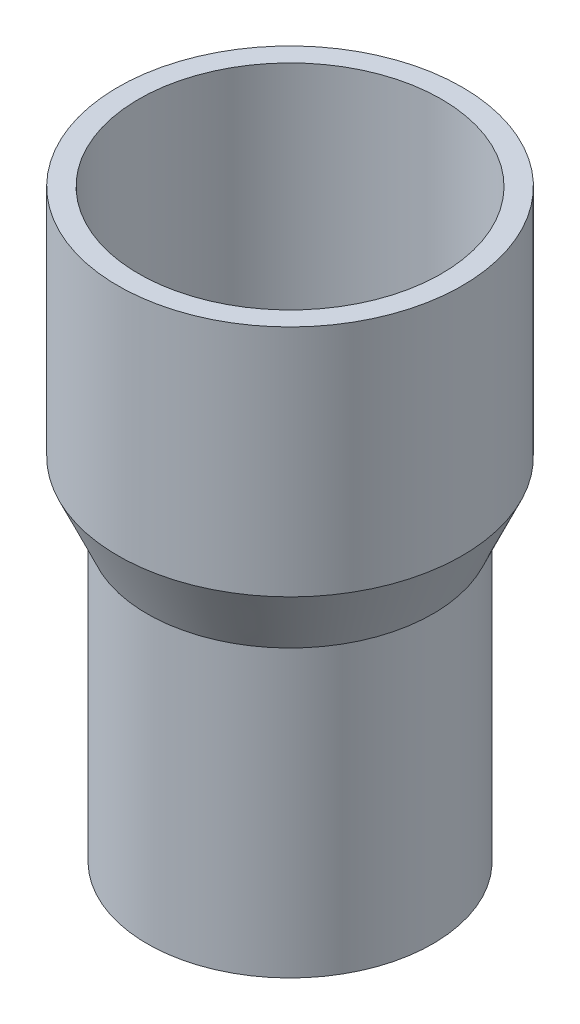
ISO-10303-21;
HEADER;
FILE_DESCRIPTION(('STEP AP214'),'2;1');
FILE_NAME('part.step','',(''),(''),'','','');
FILE_SCHEMA(('AUTOMOTIVE_DESIGN { 1 0 10303 214 1 1 1 1 }'));
ENDSEC;
DATA;
#1=APPLICATION_CONTEXT('core data for automotive mechanical design processes');
#2=APPLICATION_PROTOCOL_DEFINITION('international standard','automotive_design',2000,#1);
#3=PRODUCT_CONTEXT('',#1,'mechanical');
#4=PRODUCT('Part','Part','',(#3));
#5=PRODUCT_RELATED_PRODUCT_CATEGORY('part','',(#4));
#6=PRODUCT_DEFINITION_FORMATION('','',#4);
#7=PRODUCT_DEFINITION_CONTEXT('part definition',#1,'design');
#8=PRODUCT_DEFINITION('design','',#6,#7);
#9=PRODUCT_DEFINITION_SHAPE('','',#8);
#10=(LENGTH_UNIT() NAMED_UNIT(*) SI_UNIT(.MILLI.,.METRE.));
#11=(NAMED_UNIT(*) PLANE_ANGLE_UNIT() SI_UNIT($,.RADIAN.));
#12=(NAMED_UNIT(*) SI_UNIT($,.STERADIAN.) SOLID_ANGLE_UNIT());
#13=UNCERTAINTY_MEASURE_WITH_UNIT(LENGTH_MEASURE(1.E-05),#10,'distance_accuracy_value','');
#14=(GEOMETRIC_REPRESENTATION_CONTEXT(3) GLOBAL_UNCERTAINTY_ASSIGNED_CONTEXT((#13)) GLOBAL_UNIT_ASSIGNED_CONTEXT((#10,
#11,#12)) REPRESENTATION_CONTEXT('',''));
#15=CARTESIAN_POINT('',(0.,0.,0.));
#16=DIRECTION('',(0.,0.,1.));
#17=DIRECTION('',(1.,0.,0.));
#18=AXIS2_PLACEMENT_3D('',#15,#16,#17);
#19=CARTESIAN_POINT('',(0.,0.,0.));
#20=DIRECTION('',(0.,-1.,0.));
#21=DIRECTION('',(0.,0.,-1.));
#22=AXIS2_PLACEMENT_3D('',#19,#20,#21);
#23=CYLINDRICAL_SURFACE('',#22,9.4);
#24=CARTESIAN_POINT('',(0.,0.,0.));
#25=DIRECTION('',(0.,-1.,0.));
#26=DIRECTION('',(0.,0.,-1.));
#27=AXIS2_PLACEMENT_3D('',#24,#25,#26);
#28=CIRCLE('',#27,9.4);
#29=CARTESIAN_POINT('',(0.,0.,-9.4));
#30=VERTEX_POINT('',#29);
#31=EDGE_CURVE('E10',#30,#30,#28,.T.);
#32=ORIENTED_EDGE('',*,*,#31,.T.);
#33=EDGE_LOOP('',(#32));
#34=FACE_BOUND('',#33,.T.);
#35=CARTESIAN_POINT('',(0.,22.3434155021265,0.));
#36=DIRECTION('',(0.,-1.,0.));
#37=DIRECTION('',(0.,0.,-1.));
#38=AXIS2_PLACEMENT_3D('',#35,#36,#37);
#39=CIRCLE('',#38,9.4);
#40=CARTESIAN_POINT('',(0.,22.3434155021265,-9.4));
#41=VERTEX_POINT('',#40);
#42=EDGE_CURVE('E61',#41,#41,#39,.T.);
#43=ORIENTED_EDGE('',*,*,#42,.F.);
#44=EDGE_LOOP('',(#43));
#45=FACE_BOUND('',#44,.T.);
#46=ADVANCED_FACE('F33',(#34,#45),#23,.F.);
#47=CARTESIAN_POINT('',(-9.4,0.,0.));
#48=DIRECTION('',(0.,-1.,0.));
#49=DIRECTION('',(0.,0.,-1.));
#50=AXIS2_PLACEMENT_3D('',#47,#48,#49);
#51=PLANE('',#50);
#52=CARTESIAN_POINT('',(0.,0.,0.));
#53=DIRECTION('',(0.,-1.,0.));
#54=DIRECTION('',(0.,0.,-1.));
#55=AXIS2_PLACEMENT_3D('',#52,#53,#54);
#56=CIRCLE('',#55,11.);
#57=CARTESIAN_POINT('',(0.,0.,-11.));
#58=VERTEX_POINT('',#57);
#59=EDGE_CURVE('E39',#58,#58,#56,.T.);
#60=ORIENTED_EDGE('',*,*,#59,.T.);
#61=EDGE_LOOP('',(#60));
#62=FACE_BOUND('',#61,.T.);
#63=ORIENTED_EDGE('',*,*,#31,.F.);
#64=EDGE_LOOP('',(#63));
#65=FACE_BOUND('',#64,.T.);
#66=ADVANCED_FACE('F69',(#62,#65),#51,.T.);
#67=CARTESIAN_POINT('',(0.,0.,0.));
#68=DIRECTION('',(0.,-1.,0.));
#69=DIRECTION('',(0.,0.,-1.));
#70=AXIS2_PLACEMENT_3D('',#67,#68,#69);
#71=CYLINDRICAL_SURFACE('',#70,11.);
#72=CARTESIAN_POINT('',(0.,22.,0.));
#73=DIRECTION('',(0.,-1.,0.));
#74=DIRECTION('',(0.,0.,-1.));
#75=AXIS2_PLACEMENT_3D('',#72,#73,#74);
#76=CIRCLE('',#75,11.);
#77=CARTESIAN_POINT('',(0.,22.,-11.));
#78=VERTEX_POINT('',#77);
#79=EDGE_CURVE('E43',#78,#78,#76,.T.);
#80=ORIENTED_EDGE('',*,*,#79,.T.);
#81=EDGE_LOOP('',(#80));
#82=FACE_BOUND('',#81,.T.);
#83=ORIENTED_EDGE('',*,*,#59,.F.);
#84=EDGE_LOOP('',(#83));
#85=FACE_BOUND('',#84,.T.);
#86=ADVANCED_FACE('F73',(#82,#85),#71,.T.);
#87=CARTESIAN_POINT('',(0.,22.,0.));
#88=DIRECTION('',(0.,1.,0.));
#89=DIRECTION('',(0.,0.,1.));
#90=AXIS2_PLACEMENT_3D('',#87,#88,#89);
#91=CONICAL_SURFACE('',#90,11.,0.422853926132941);
#92=CARTESIAN_POINT('',(0.,27.,0.));
#93=DIRECTION('',(0.,-1.,0.));
#94=DIRECTION('',(0.,0.,-1.));
#95=AXIS2_PLACEMENT_3D('',#92,#93,#94);
#96=CIRCLE('',#95,13.25);
#97=CARTESIAN_POINT('',(0.,27.,-13.25));
#98=VERTEX_POINT('',#97);
#99=EDGE_CURVE('E47',#98,#98,#96,.T.);
#100=ORIENTED_EDGE('',*,*,#99,.T.);
#101=EDGE_LOOP('',(#100));
#102=FACE_BOUND('',#101,.T.);
#103=ORIENTED_EDGE('',*,*,#79,.F.);
#104=EDGE_LOOP('',(#103));
#105=FACE_BOUND('',#104,.T.);
#106=ADVANCED_FACE('F77',(#102,#105),#91,.T.);
#107=CARTESIAN_POINT('',(0.,0.,0.));
#108=DIRECTION('',(0.,-1.,0.));
#109=DIRECTION('',(0.,0.,-1.));
#110=AXIS2_PLACEMENT_3D('',#107,#108,#109);
#111=CYLINDRICAL_SURFACE('',#110,13.25);
#112=CARTESIAN_POINT('',(0.,45.,0.));
#113=DIRECTION('',(0.,-1.,0.));
#114=DIRECTION('',(0.,0.,-1.));
#115=AXIS2_PLACEMENT_3D('',#112,#113,#114);
#116=CIRCLE('',#115,13.25);
#117=CARTESIAN_POINT('',(0.,45.,-13.25));
#118=VERTEX_POINT('',#117);
#119=EDGE_CURVE('E52',#118,#118,#116,.T.);
#120=ORIENTED_EDGE('',*,*,#119,.T.);
#121=EDGE_LOOP('',(#120));
#122=FACE_BOUND('',#121,.T.);
#123=ORIENTED_EDGE('',*,*,#99,.F.);
#124=EDGE_LOOP('',(#123));
#125=FACE_BOUND('',#124,.T.);
#126=ADVANCED_FACE('F84',(#122,#125),#111,.T.);
#127=CARTESIAN_POINT('',(-13.25,45.,0.));
#128=DIRECTION('',(0.,1.,0.));
#129=DIRECTION('',(0.,0.,1.));
#130=AXIS2_PLACEMENT_3D('',#127,#128,#129);
#131=PLANE('',#130);
#132=CARTESIAN_POINT('',(0.,45.,0.));
#133=DIRECTION('',(0.,-1.,0.));
#134=DIRECTION('',(0.,0.,-1.));
#135=AXIS2_PLACEMENT_3D('',#132,#133,#134);
#136=CIRCLE('',#135,11.65);
#137=CARTESIAN_POINT('',(0.,45.,-11.65));
#138=VERTEX_POINT('',#137);
#139=EDGE_CURVE('E55',#138,#138,#136,.T.);
#140=ORIENTED_EDGE('',*,*,#139,.T.);
#141=EDGE_LOOP('',(#140));
#142=FACE_BOUND('',#141,.T.);
#143=ORIENTED_EDGE('',*,*,#119,.F.);
#144=EDGE_LOOP('',(#143));
#145=FACE_BOUND('',#144,.T.);
#146=ADVANCED_FACE('F88',(#142,#145),#131,.T.);
#147=CARTESIAN_POINT('',(0.,0.,0.));
#148=DIRECTION('',(0.,-1.,0.));
#149=DIRECTION('',(0.,0.,-1.));
#150=AXIS2_PLACEMENT_3D('',#147,#148,#149);
#151=CYLINDRICAL_SURFACE('',#150,11.65);
#152=CARTESIAN_POINT('',(0.,27.3434155021264,0.));
#153=DIRECTION('',(0.,-1.,0.));
#154=DIRECTION('',(0.,0.,-1.));
#155=AXIS2_PLACEMENT_3D('',#152,#153,#154);
#156=CIRCLE('',#155,11.65);
#157=CARTESIAN_POINT('',(0.,27.3434155021264,-11.65));
#158=VERTEX_POINT('',#157);
#159=EDGE_CURVE('E58',#158,#158,#156,.T.);
#160=ORIENTED_EDGE('',*,*,#159,.T.);
#161=EDGE_LOOP('',(#160));
#162=FACE_BOUND('',#161,.T.);
#163=ORIENTED_EDGE('',*,*,#139,.F.);
#164=EDGE_LOOP('',(#163));
#165=FACE_BOUND('',#164,.T.);
#166=ADVANCED_FACE('F92',(#162,#165),#151,.F.);
#167=CARTESIAN_POINT('',(0.,27.3434155021264,0.));
#168=DIRECTION('',(0.,1.,0.));
#169=DIRECTION('',(0.,0.,1.));
#170=AXIS2_PLACEMENT_3D('',#167,#168,#169);
#171=CONICAL_SURFACE('',#170,11.65,0.422853926132941);
#172=ORIENTED_EDGE('',*,*,#42,.T.);
#173=EDGE_LOOP('',(#172));
#174=FACE_BOUND('',#173,.T.);
#175=ORIENTED_EDGE('',*,*,#159,.F.);
#176=EDGE_LOOP('',(#175));
#177=FACE_BOUND('',#176,.T.);
#178=ADVANCED_FACE('F65',(#174,#177),#171,.F.);
#179=CLOSED_SHELL('',(#46,#66,#86,#106,#126,#146,#166,#178));
#180=MANIFOLD_SOLID_BREP('B2',#179);
#181=ADVANCED_BREP_SHAPE_REPRESENTATION('',(#18,#180),#14);
#182=SHAPE_DEFINITION_REPRESENTATION(#9,#181);
ENDSEC;
END-ISO-10303-21;
